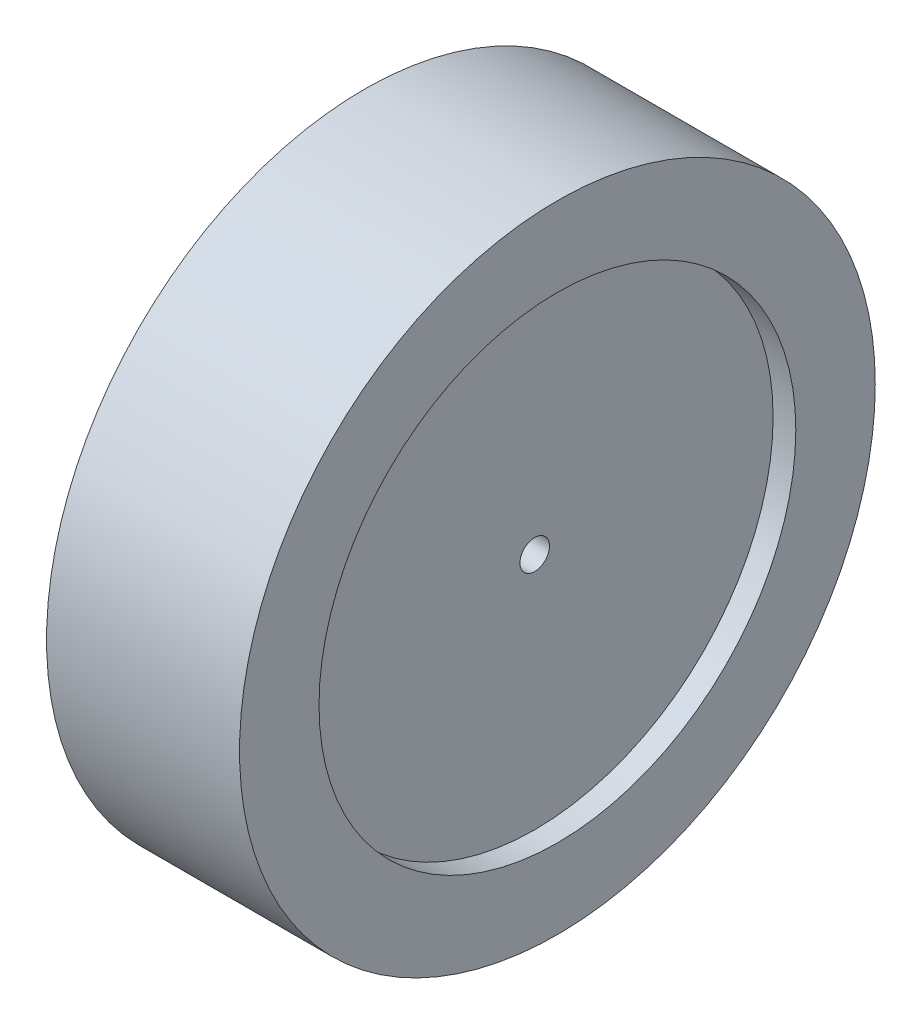
ISO-10303-21;
HEADER;
FILE_DESCRIPTION(('STEP AP214'),'2;1');
FILE_NAME('part.step','',(''),(''),'','','');
FILE_SCHEMA(('AUTOMOTIVE_DESIGN { 1 0 10303 214 1 1 1 1 }'));
ENDSEC;
DATA;
#1=APPLICATION_CONTEXT('core data for automotive mechanical design processes');
#2=APPLICATION_PROTOCOL_DEFINITION('international standard','automotive_design',2000,#1);
#3=PRODUCT_CONTEXT('',#1,'mechanical');
#4=PRODUCT('Part','Part','',(#3));
#5=PRODUCT_RELATED_PRODUCT_CATEGORY('part','',(#4));
#6=PRODUCT_DEFINITION_FORMATION('','',#4);
#7=PRODUCT_DEFINITION_CONTEXT('part definition',#1,'design');
#8=PRODUCT_DEFINITION('design','',#6,#7);
#9=PRODUCT_DEFINITION_SHAPE('','',#8);
#10=(LENGTH_UNIT() NAMED_UNIT(*) SI_UNIT(.MILLI.,.METRE.));
#11=(NAMED_UNIT(*) PLANE_ANGLE_UNIT() SI_UNIT($,.RADIAN.));
#12=(NAMED_UNIT(*) SI_UNIT($,.STERADIAN.) SOLID_ANGLE_UNIT());
#13=UNCERTAINTY_MEASURE_WITH_UNIT(LENGTH_MEASURE(1.E-05),#10,'distance_accuracy_value','');
#14=(GEOMETRIC_REPRESENTATION_CONTEXT(3) GLOBAL_UNCERTAINTY_ASSIGNED_CONTEXT((#13)) GLOBAL_UNIT_ASSIGNED_CONTEXT((#10,
#11,#12)) REPRESENTATION_CONTEXT('',''));
#15=CARTESIAN_POINT('',(0.,0.,0.));
#16=DIRECTION('',(0.,0.,1.));
#17=DIRECTION('',(1.,0.,0.));
#18=AXIS2_PLACEMENT_3D('',#15,#16,#17);
#19=CARTESIAN_POINT('',(0.,0.,0.));
#20=DIRECTION('',(1.,0.,0.));
#21=DIRECTION('',(0.,0.,-1.));
#22=AXIS2_PLACEMENT_3D('',#19,#20,#21);
#23=CYLINDRICAL_SURFACE('',#22,1.3);
#24=CARTESIAN_POINT('',(15.,0.,0.));
#25=DIRECTION('',(1.,0.,0.));
#26=DIRECTION('',(0.,0.,-1.));
#27=AXIS2_PLACEMENT_3D('',#24,#25,#26);
#28=CIRCLE('',#27,1.3);
#29=CARTESIAN_POINT('',(15.,0.,-1.3));
#30=VERTEX_POINT('',#29);
#31=EDGE_CURVE('E47',#30,#30,#28,.F.);
#32=ORIENTED_EDGE('',*,*,#31,.F.);
#33=EDGE_LOOP('',(#32));
#34=FACE_BOUND('',#33,.T.);
#35=CARTESIAN_POINT('',(2.,0.,0.));
#36=DIRECTION('',(-1.,0.,0.));
#37=DIRECTION('',(0.,0.,1.));
#38=AXIS2_PLACEMENT_3D('',#35,#36,#37);
#39=CIRCLE('',#38,1.3);
#40=CARTESIAN_POINT('',(2.,0.,1.3));
#41=VERTEX_POINT('',#40);
#42=EDGE_CURVE('E38',#41,#41,#39,.F.);
#43=ORIENTED_EDGE('',*,*,#42,.F.);
#44=EDGE_LOOP('',(#43));
#45=FACE_BOUND('',#44,.T.);
#46=ADVANCED_FACE('F34',(#34,#45),#23,.F.);
#47=CARTESIAN_POINT('',(17.,0.,0.));
#48=DIRECTION('',(-1.,0.,0.));
#49=DIRECTION('',(0.,0.,1.));
#50=AXIS2_PLACEMENT_3D('',#47,#48,#49);
#51=CYLINDRICAL_SURFACE('',#50,28.);
#52=CARTESIAN_POINT('',(17.,0.,0.));
#53=DIRECTION('',(1.,0.,0.));
#54=DIRECTION('',(0.,0.,-1.));
#55=AXIS2_PLACEMENT_3D('',#52,#53,#54);
#56=CIRCLE('',#55,28.);
#57=CARTESIAN_POINT('',(17.,0.,-28.));
#58=VERTEX_POINT('',#57);
#59=EDGE_CURVE('E10',#58,#58,#56,.T.);
#60=ORIENTED_EDGE('',*,*,#59,.F.);
#61=EDGE_LOOP('',(#60));
#62=FACE_BOUND('',#61,.T.);
#63=CARTESIAN_POINT('',(0.,0.,0.));
#64=DIRECTION('',(1.,0.,0.));
#65=DIRECTION('',(0.,0.,-1.));
#66=AXIS2_PLACEMENT_3D('',#63,#64,#65);
#67=CIRCLE('',#66,28.);
#68=CARTESIAN_POINT('',(0.,0.,-28.));
#69=VERTEX_POINT('',#68);
#70=EDGE_CURVE('E42',#69,#69,#67,.T.);
#71=ORIENTED_EDGE('',*,*,#70,.T.);
#72=EDGE_LOOP('',(#71));
#73=FACE_BOUND('',#72,.T.);
#74=ADVANCED_FACE('F36',(#62,#73),#51,.T.);
#75=CARTESIAN_POINT('',(17.,0.,0.));
#76=DIRECTION('',(1.,0.,0.));
#77=DIRECTION('',(0.,0.,-1.));
#78=AXIS2_PLACEMENT_3D('',#75,#76,#77);
#79=PLANE('',#78);
#80=CARTESIAN_POINT('',(17.,0.,0.));
#81=DIRECTION('',(1.,0.,0.));
#82=DIRECTION('',(0.,0.,-1.));
#83=AXIS2_PLACEMENT_3D('',#80,#81,#82);
#84=CIRCLE('',#83,21.);
#85=CARTESIAN_POINT('',(17.,0.,-21.));
#86=VERTEX_POINT('',#85);
#87=EDGE_CURVE('E50',#86,#86,#84,.T.);
#88=ORIENTED_EDGE('',*,*,#87,.F.);
#89=EDGE_LOOP('',(#88));
#90=FACE_BOUND('',#89,.T.);
#91=ORIENTED_EDGE('',*,*,#59,.T.);
#92=EDGE_LOOP('',(#91));
#93=FACE_BOUND('',#92,.T.);
#94=ADVANCED_FACE('F79',(#90,#93),#79,.T.);
#95=CARTESIAN_POINT('',(0.,0.,0.));
#96=DIRECTION('',(1.,0.,0.));
#97=DIRECTION('',(0.,0.,-1.));
#98=AXIS2_PLACEMENT_3D('',#95,#96,#97);
#99=PLANE('',#98);
#100=CARTESIAN_POINT('',(0.,0.,0.));
#101=DIRECTION('',(1.,0.,0.));
#102=DIRECTION('',(0.,0.,-1.));
#103=AXIS2_PLACEMENT_3D('',#100,#101,#102);
#104=CIRCLE('',#103,21.);
#105=CARTESIAN_POINT('',(0.,0.,-21.));
#106=VERTEX_POINT('',#105);
#107=EDGE_CURVE('E61',#106,#106,#104,.T.);
#108=ORIENTED_EDGE('',*,*,#107,.T.);
#109=EDGE_LOOP('',(#108));
#110=FACE_BOUND('',#109,.T.);
#111=ORIENTED_EDGE('',*,*,#70,.F.);
#112=EDGE_LOOP('',(#111));
#113=FACE_BOUND('',#112,.T.);
#114=ADVANCED_FACE('F86',(#110,#113),#99,.F.);
#115=CARTESIAN_POINT('',(15.,0.,0.));
#116=DIRECTION('',(1.,0.,0.));
#117=DIRECTION('',(0.,0.,-1.));
#118=AXIS2_PLACEMENT_3D('',#115,#116,#117);
#119=PLANE('',#118);
#120=CARTESIAN_POINT('',(15.,0.,0.));
#121=DIRECTION('',(1.,0.,0.));
#122=DIRECTION('',(0.,0.,-1.));
#123=AXIS2_PLACEMENT_3D('',#120,#121,#122);
#124=CIRCLE('',#123,21.);
#125=CARTESIAN_POINT('',(15.,0.,-21.));
#126=VERTEX_POINT('',#125);
#127=EDGE_CURVE('E53',#126,#126,#124,.T.);
#128=ORIENTED_EDGE('',*,*,#127,.T.);
#129=EDGE_LOOP('',(#128));
#130=FACE_BOUND('',#129,.T.);
#131=ORIENTED_EDGE('',*,*,#31,.T.);
#132=EDGE_LOOP('',(#131));
#133=FACE_BOUND('',#132,.T.);
#134=ADVANCED_FACE('F89',(#130,#133),#119,.T.);
#135=CARTESIAN_POINT('',(15.,0.,0.));
#136=DIRECTION('',(1.,0.,0.));
#137=DIRECTION('',(0.,0.,-1.));
#138=AXIS2_PLACEMENT_3D('',#135,#136,#137);
#139=CYLINDRICAL_SURFACE('',#138,21.);
#140=ORIENTED_EDGE('',*,*,#127,.F.);
#141=EDGE_LOOP('',(#140));
#142=FACE_BOUND('',#141,.T.);
#143=ORIENTED_EDGE('',*,*,#87,.T.);
#144=EDGE_LOOP('',(#143));
#145=FACE_BOUND('',#144,.T.);
#146=ADVANCED_FACE('F83',(#142,#145),#139,.F.);
#147=CARTESIAN_POINT('',(2.,0.,0.));
#148=DIRECTION('',(-1.,0.,0.));
#149=DIRECTION('',(0.,0.,-1.));
#150=AXIS2_PLACEMENT_3D('',#147,#148,#149);
#151=PLANE('',#150);
#152=CARTESIAN_POINT('',(2.,0.,0.));
#153=DIRECTION('',(1.,0.,0.));
#154=DIRECTION('',(0.,0.,-1.));
#155=AXIS2_PLACEMENT_3D('',#152,#153,#154);
#156=CIRCLE('',#155,21.);
#157=CARTESIAN_POINT('',(2.,0.,-21.));
#158=VERTEX_POINT('',#157);
#159=EDGE_CURVE('E64',#158,#158,#156,.T.);
#160=ORIENTED_EDGE('',*,*,#159,.F.);
#161=EDGE_LOOP('',(#160));
#162=FACE_BOUND('',#161,.T.);
#163=ORIENTED_EDGE('',*,*,#42,.T.);
#164=EDGE_LOOP('',(#163));
#165=FACE_BOUND('',#164,.T.);
#166=ADVANCED_FACE('F71',(#162,#165),#151,.T.);
#167=CARTESIAN_POINT('',(2.,0.,0.));
#168=DIRECTION('',(-1.,0.,0.));
#169=DIRECTION('',(0.,0.,1.));
#170=AXIS2_PLACEMENT_3D('',#167,#168,#169);
#171=CYLINDRICAL_SURFACE('',#170,21.);
#172=ORIENTED_EDGE('',*,*,#159,.T.);
#173=EDGE_LOOP('',(#172));
#174=FACE_BOUND('',#173,.T.);
#175=ORIENTED_EDGE('',*,*,#107,.F.);
#176=EDGE_LOOP('',(#175));
#177=FACE_BOUND('',#176,.T.);
#178=ADVANCED_FACE('F99',(#174,#177),#171,.F.);
#179=CLOSED_SHELL('',(#46,#74,#94,#114,#134,#146,#166,#178));
#180=MANIFOLD_SOLID_BREP('B2',#179);
#181=ADVANCED_BREP_SHAPE_REPRESENTATION('',(#18,#180),#14);
#182=SHAPE_DEFINITION_REPRESENTATION(#9,#181);
ENDSEC;
END-ISO-10303-21;
